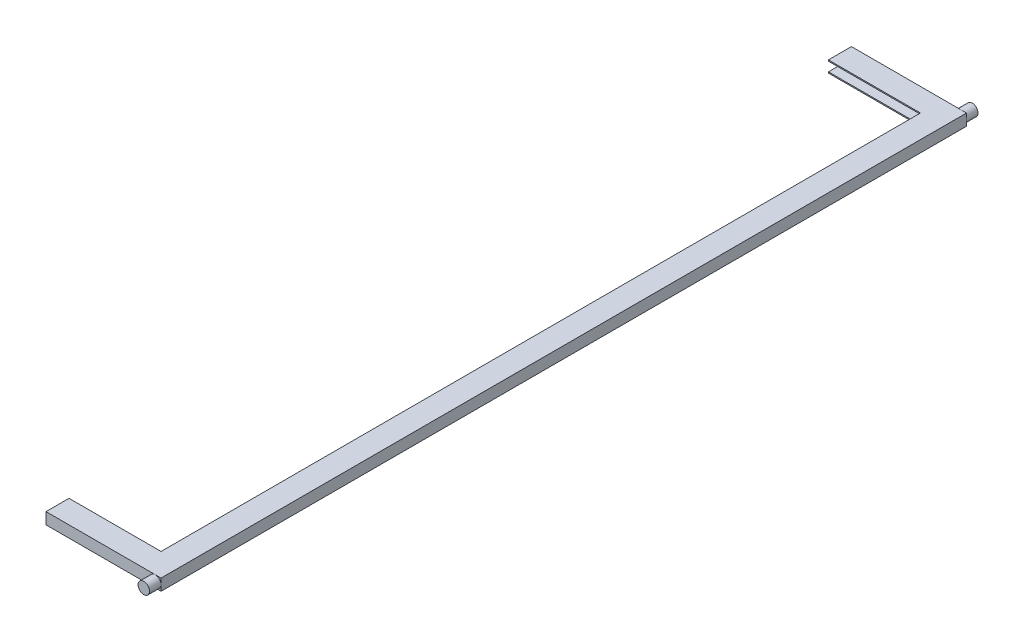
ISO-10303-21;
HEADER;
FILE_DESCRIPTION(('STEP AP214'),'2;1');
FILE_NAME('part.step','',(''),(''),'','','');
FILE_SCHEMA(('AUTOMOTIVE_DESIGN { 1 0 10303 214 1 1 1 1 }'));
ENDSEC;
DATA;
#1=APPLICATION_CONTEXT('core data for automotive mechanical design processes');
#2=APPLICATION_PROTOCOL_DEFINITION('international standard','automotive_design',2000,#1);
#3=PRODUCT_CONTEXT('',#1,'mechanical');
#4=PRODUCT('Part','Part','',(#3));
#5=PRODUCT_RELATED_PRODUCT_CATEGORY('part','',(#4));
#6=PRODUCT_DEFINITION_FORMATION('','',#4);
#7=PRODUCT_DEFINITION_CONTEXT('part definition',#1,'design');
#8=PRODUCT_DEFINITION('design','',#6,#7);
#9=PRODUCT_DEFINITION_SHAPE('','',#8);
#10=(LENGTH_UNIT() NAMED_UNIT(*) SI_UNIT(.MILLI.,.METRE.));
#11=(NAMED_UNIT(*) PLANE_ANGLE_UNIT() SI_UNIT($,.RADIAN.));
#12=(NAMED_UNIT(*) SI_UNIT($,.STERADIAN.) SOLID_ANGLE_UNIT());
#13=UNCERTAINTY_MEASURE_WITH_UNIT(LENGTH_MEASURE(1.E-05),#10,'distance_accuracy_value','');
#14=(GEOMETRIC_REPRESENTATION_CONTEXT(3) GLOBAL_UNCERTAINTY_ASSIGNED_CONTEXT((#13)) GLOBAL_UNIT_ASSIGNED_CONTEXT((#10,
#11,#12)) REPRESENTATION_CONTEXT('',''));
#15=CARTESIAN_POINT('',(0.,0.,0.));
#16=DIRECTION('',(0.,0.,1.));
#17=DIRECTION('',(1.,0.,0.));
#18=AXIS2_PLACEMENT_3D('',#15,#16,#17);
#19=CARTESIAN_POINT('',(-50.,10.,350.));
#20=DIRECTION('',(1.,0.,0.));
#21=DIRECTION('',(0.,0.,-1.));
#22=AXIS2_PLACEMENT_3D('',#19,#20,#21);
#23=PLANE('',#22);
#24=DIRECTION('',(0.,0.,1.));
#25=VECTOR('',#24,1.);
#26=CARTESIAN_POINT('',(-50.,0.,350.));
#27=LINE('',#26,#25);
#28=CARTESIAN_POINT('',(-50.,0.,-350.));
#29=VERTEX_POINT('',#28);
#30=CARTESIAN_POINT('',(-50.,0.,-330.));
#31=VERTEX_POINT('',#30);
#32=EDGE_CURVE('E190',#29,#31,#27,.T.);
#33=ORIENTED_EDGE('',*,*,#32,.T.);
#34=DIRECTION('',(0.,1.,0.));
#35=VECTOR('',#34,1.);
#36=CARTESIAN_POINT('',(-50.,0.,-330.));
#37=LINE('',#36,#35);
#38=CARTESIAN_POINT('',(-50.,1.,-330.));
#39=VERTEX_POINT('',#38);
#40=EDGE_CURVE('E234',#31,#39,#37,.T.);
#41=ORIENTED_EDGE('',*,*,#40,.T.);
#42=DIRECTION('',(0.,0.,1.));
#43=VECTOR('',#42,1.);
#44=CARTESIAN_POINT('',(-50.,1.,-349.));
#45=LINE('',#44,#43);
#46=CARTESIAN_POINT('',(-50.,1.,-349.));
#47=VERTEX_POINT('',#46);
#48=EDGE_CURVE('E264',#47,#39,#45,.T.);
#49=ORIENTED_EDGE('',*,*,#48,.F.);
#50=DIRECTION('',(0.,-1.,0.));
#51=VECTOR('',#50,1.);
#52=CARTESIAN_POINT('',(-50.,9.,-349.));
#53=LINE('',#52,#51);
#54=CARTESIAN_POINT('',(-50.,9.,-349.));
#55=VERTEX_POINT('',#54);
#56=EDGE_CURVE('E250',#55,#47,#53,.T.);
#57=ORIENTED_EDGE('',*,*,#56,.F.);
#58=DIRECTION('',(0.,0.,1.));
#59=VECTOR('',#58,1.);
#60=CARTESIAN_POINT('',(-50.,9.,-349.));
#61=LINE('',#60,#59);
#62=CARTESIAN_POINT('',(-50.,9.,-330.));
#63=VERTEX_POINT('',#62);
#64=EDGE_CURVE('E259',#55,#63,#61,.T.);
#65=ORIENTED_EDGE('',*,*,#64,.T.);
#66=CARTESIAN_POINT('',(-50.,10.,-330.));
#67=VERTEX_POINT('',#66);
#68=EDGE_CURVE('E230',#63,#67,#37,.T.);
#69=ORIENTED_EDGE('',*,*,#68,.T.);
#70=DIRECTION('',(0.,0.,1.));
#71=VECTOR('',#70,1.);
#72=CARTESIAN_POINT('',(-50.,10.,350.));
#73=LINE('',#72,#71);
#74=CARTESIAN_POINT('',(-50.,10.,-350.));
#75=VERTEX_POINT('',#74);
#76=EDGE_CURVE('E299',#75,#67,#73,.T.);
#77=ORIENTED_EDGE('',*,*,#76,.F.);
#78=DIRECTION('',(0.,-1.,0.));
#79=VECTOR('',#78,1.);
#80=CARTESIAN_POINT('',(-50.,10.,-350.));
#81=LINE('',#80,#79);
#82=EDGE_CURVE('E207',#75,#29,#81,.T.);
#83=ORIENTED_EDGE('',*,*,#82,.T.);
#84=EDGE_LOOP('',(#33,#41,#49,#57,#65,#69,#77,#83));
#85=FACE_BOUND('',#84,.T.);
#86=ADVANCED_FACE('F33',(#85),#23,.F.);
#87=CARTESIAN_POINT('',(-49.9999999999999,10.,330.));
#88=VERTEX_POINT('',#87);
#89=CARTESIAN_POINT('',(-50.,10.,350.));
#90=VERTEX_POINT('',#89);
#91=EDGE_CURVE('E298',#88,#90,#73,.T.);
#92=ORIENTED_EDGE('',*,*,#91,.F.);
#93=DIRECTION('',(0.,1.,0.));
#94=VECTOR('',#93,1.);
#95=CARTESIAN_POINT('',(-49.9999999999999,0.,330.));
#96=LINE('',#95,#94);
#97=CARTESIAN_POINT('',(-49.9999999999999,9.,330.));
#98=VERTEX_POINT('',#97);
#99=EDGE_CURVE('E182',#98,#88,#96,.T.);
#100=ORIENTED_EDGE('',*,*,#99,.F.);
#101=CARTESIAN_POINT('',(-50.,9.,349.));
#102=VERTEX_POINT('',#101);
#103=EDGE_CURVE('E245',#98,#102,#61,.T.);
#104=ORIENTED_EDGE('',*,*,#103,.T.);
#105=DIRECTION('',(0.,-1.,0.));
#106=VECTOR('',#105,1.);
#107=CARTESIAN_POINT('',(-50.,9.,349.));
#108=LINE('',#107,#106);
#109=CARTESIAN_POINT('',(-50.,1.,349.));
#110=VERTEX_POINT('',#109);
#111=EDGE_CURVE('E262',#102,#110,#108,.T.);
#112=ORIENTED_EDGE('',*,*,#111,.T.);
#113=CARTESIAN_POINT('',(-50.,1.,330.));
#114=VERTEX_POINT('',#113);
#115=EDGE_CURVE('E181',#114,#110,#45,.T.);
#116=ORIENTED_EDGE('',*,*,#115,.F.);
#117=CARTESIAN_POINT('',(-49.9999999999999,0.,330.));
#118=VERTEX_POINT('',#117);
#119=EDGE_CURVE('E56',#118,#114,#96,.T.);
#120=ORIENTED_EDGE('',*,*,#119,.F.);
#121=CARTESIAN_POINT('',(-50.,0.,350.));
#122=VERTEX_POINT('',#121);
#123=EDGE_CURVE('E178',#118,#122,#27,.T.);
#124=ORIENTED_EDGE('',*,*,#123,.T.);
#125=DIRECTION('',(0.,-1.,0.));
#126=VECTOR('',#125,1.);
#127=CARTESIAN_POINT('',(-50.,10.,350.));
#128=LINE('',#127,#126);
#129=EDGE_CURVE('E204',#90,#122,#128,.T.);
#130=ORIENTED_EDGE('',*,*,#129,.F.);
#131=EDGE_LOOP('',(#92,#100,#104,#112,#116,#120,#124,#130));
#132=FACE_BOUND('',#131,.T.);
#133=ADVANCED_FACE('F176',(#132),#23,.F.);
#134=CARTESIAN_POINT('',(-50.,10.,-350.));
#135=DIRECTION('',(0.,0.,1.));
#136=DIRECTION('',(1.,0.,0.));
#137=AXIS2_PLACEMENT_3D('',#134,#135,#136);
#138=PLANE('',#137);
#139=CARTESIAN_POINT('',(45.,5.,-350.));
#140=DIRECTION('',(0.,0.,-1.));
#141=DIRECTION('',(-1.,0.,0.));
#142=AXIS2_PLACEMENT_3D('',#139,#140,#141);
#143=CIRCLE('',#142,5.);
#144=CARTESIAN_POINT('',(45.,10.,-350.));
#145=VERTEX_POINT('',#144);
#146=CARTESIAN_POINT('',(50.,5.,-350.));
#147=VERTEX_POINT('',#146);
#148=EDGE_CURVE('E278',#145,#147,#143,.T.);
#149=ORIENTED_EDGE('',*,*,#148,.F.);
#150=DIRECTION('',(-1.,0.,0.));
#151=VECTOR('',#150,1.);
#152=CARTESIAN_POINT('',(-50.,10.,-350.));
#153=LINE('',#152,#151);
#154=CARTESIAN_POINT('',(50.,10.,-350.));
#155=VERTEX_POINT('',#154);
#156=EDGE_CURVE('E296',#155,#145,#153,.T.);
#157=ORIENTED_EDGE('',*,*,#156,.F.);
#158=DIRECTION('',(0.,-1.,0.));
#159=VECTOR('',#158,1.);
#160=CARTESIAN_POINT('',(50.,10.,-350.));
#161=LINE('',#160,#159);
#162=EDGE_CURVE('E211',#155,#147,#161,.T.);
#163=ORIENTED_EDGE('',*,*,#162,.T.);
#164=EDGE_LOOP('',(#149,#157,#163));
#165=FACE_BOUND('',#164,.T.);
#166=ADVANCED_FACE('F337',(#165),#138,.F.);
#167=CARTESIAN_POINT('',(45.,0.,-350.));
#168=VERTEX_POINT('',#167);
#169=EDGE_CURVE('E216',#147,#168,#143,.T.);
#170=ORIENTED_EDGE('',*,*,#169,.F.);
#171=CARTESIAN_POINT('',(50.,0.,-350.));
#172=VERTEX_POINT('',#171);
#173=EDGE_CURVE('E210',#147,#172,#161,.T.);
#174=ORIENTED_EDGE('',*,*,#173,.T.);
#175=DIRECTION('',(-1.,0.,0.));
#176=VECTOR('',#175,1.);
#177=CARTESIAN_POINT('',(-50.,0.,-350.));
#178=LINE('',#177,#176);
#179=EDGE_CURVE('E191',#172,#168,#178,.T.);
#180=ORIENTED_EDGE('',*,*,#179,.T.);
#181=EDGE_LOOP('',(#170,#174,#180));
#182=FACE_BOUND('',#181,.T.);
#183=ADVANCED_FACE('F396',(#182),#138,.F.);
#184=EDGE_CURVE('E285',#168,#145,#143,.T.);
#185=ORIENTED_EDGE('',*,*,#184,.F.);
#186=EDGE_CURVE('E196',#168,#29,#178,.T.);
#187=ORIENTED_EDGE('',*,*,#186,.T.);
#188=ORIENTED_EDGE('',*,*,#82,.F.);
#189=EDGE_CURVE('E295',#145,#75,#153,.T.);
#190=ORIENTED_EDGE('',*,*,#189,.F.);
#191=EDGE_LOOP('',(#185,#187,#188,#190));
#192=FACE_BOUND('',#191,.T.);
#193=ADVANCED_FACE('F312',(#192),#138,.F.);
#194=CARTESIAN_POINT('',(-50.,10.,350.));
#195=DIRECTION('',(0.,0.,-1.));
#196=DIRECTION('',(-1.,0.,0.));
#197=AXIS2_PLACEMENT_3D('',#194,#195,#196);
#198=PLANE('',#197);
#199=CARTESIAN_POINT('',(45.,5.,350.));
#200=DIRECTION('',(0.,0.,1.));
#201=DIRECTION('',(1.,0.,0.));
#202=AXIS2_PLACEMENT_3D('',#199,#200,#201);
#203=CIRCLE('',#202,5.);
#204=CARTESIAN_POINT('',(50.,5.,350.));
#205=VERTEX_POINT('',#204);
#206=CARTESIAN_POINT('',(45.,10.,350.));
#207=VERTEX_POINT('',#206);
#208=EDGE_CURVE('E282',#205,#207,#203,.T.);
#209=ORIENTED_EDGE('',*,*,#208,.F.);
#210=DIRECTION('',(0.,-1.,0.));
#211=VECTOR('',#210,1.);
#212=CARTESIAN_POINT('',(50.,10.,350.));
#213=LINE('',#212,#211);
#214=CARTESIAN_POINT('',(50.,10.,350.));
#215=VERTEX_POINT('',#214);
#216=EDGE_CURVE('E202',#215,#205,#213,.T.);
#217=ORIENTED_EDGE('',*,*,#216,.F.);
#218=DIRECTION('',(1.,0.,0.));
#219=VECTOR('',#218,1.);
#220=CARTESIAN_POINT('',(-50.,10.,350.));
#221=LINE('',#220,#219);
#222=EDGE_CURVE('E302',#207,#215,#221,.T.);
#223=ORIENTED_EDGE('',*,*,#222,.F.);
#224=EDGE_LOOP('',(#209,#217,#223));
#225=FACE_BOUND('',#224,.T.);
#226=ADVANCED_FACE('F393',(#225),#198,.F.);
#227=CARTESIAN_POINT('',(45.,0.,350.));
#228=VERTEX_POINT('',#227);
#229=EDGE_CURVE('E292',#207,#228,#203,.T.);
#230=ORIENTED_EDGE('',*,*,#229,.F.);
#231=EDGE_CURVE('E303',#90,#207,#221,.T.);
#232=ORIENTED_EDGE('',*,*,#231,.F.);
#233=ORIENTED_EDGE('',*,*,#129,.T.);
#234=DIRECTION('',(1.,0.,0.));
#235=VECTOR('',#234,1.);
#236=CARTESIAN_POINT('',(-50.,0.,350.));
#237=LINE('',#236,#235);
#238=EDGE_CURVE('E189',#122,#228,#237,.T.);
#239=ORIENTED_EDGE('',*,*,#238,.T.);
#240=EDGE_LOOP('',(#230,#232,#233,#239));
#241=FACE_BOUND('',#240,.T.);
#242=ADVANCED_FACE('F352',(#241),#198,.F.);
#243=EDGE_CURVE('E214',#228,#205,#203,.T.);
#244=ORIENTED_EDGE('',*,*,#243,.F.);
#245=CARTESIAN_POINT('',(50.,0.,350.));
#246=VERTEX_POINT('',#245);
#247=EDGE_CURVE('E194',#228,#246,#237,.T.);
#248=ORIENTED_EDGE('',*,*,#247,.T.);
#249=EDGE_CURVE('E205',#205,#246,#213,.T.);
#250=ORIENTED_EDGE('',*,*,#249,.F.);
#251=EDGE_LOOP('',(#244,#248,#250));
#252=FACE_BOUND('',#251,.T.);
#253=ADVANCED_FACE('F350',(#252),#198,.F.);
#254=CARTESIAN_POINT('',(50.,10.,350.));
#255=DIRECTION('',(-1.,0.,0.));
#256=DIRECTION('',(0.,0.,1.));
#257=AXIS2_PLACEMENT_3D('',#254,#255,#256);
#258=PLANE('',#257);
#259=DIRECTION('',(0.,0.,-1.));
#260=VECTOR('',#259,1.);
#261=CARTESIAN_POINT('',(50.,0.,350.));
#262=LINE('',#261,#260);
#263=EDGE_CURVE('E289',#246,#172,#262,.T.);
#264=ORIENTED_EDGE('',*,*,#263,.T.);
#265=ORIENTED_EDGE('',*,*,#173,.F.);
#266=ORIENTED_EDGE('',*,*,#162,.F.);
#267=DIRECTION('',(0.,0.,-1.));
#268=VECTOR('',#267,1.);
#269=CARTESIAN_POINT('',(50.,10.,350.));
#270=LINE('',#269,#268);
#271=EDGE_CURVE('E201',#215,#155,#270,.T.);
#272=ORIENTED_EDGE('',*,*,#271,.F.);
#273=ORIENTED_EDGE('',*,*,#216,.T.);
#274=ORIENTED_EDGE('',*,*,#249,.T.);
#275=EDGE_LOOP('',(#264,#265,#266,#272,#273,#274));
#276=FACE_BOUND('',#275,.T.);
#277=ADVANCED_FACE('F35',(#276),#258,.F.);
#278=CARTESIAN_POINT('',(0.,10.,0.));
#279=DIRECTION('',(0.,-1.,0.));
#280=DIRECTION('',(0.,0.,-1.));
#281=AXIS2_PLACEMENT_3D('',#278,#279,#280);
#282=PLANE('',#281);
#283=ORIENTED_EDGE('',*,*,#76,.T.);
#284=DIRECTION('',(-1.,0.,0.));
#285=VECTOR('',#284,1.);
#286=CARTESIAN_POINT('',(-50.,10.,-330.));
#287=LINE('',#286,#285);
#288=CARTESIAN_POINT('',(30.,10.,-330.));
#289=VERTEX_POINT('',#288);
#290=EDGE_CURVE('E171',#289,#67,#287,.T.);
#291=ORIENTED_EDGE('',*,*,#290,.F.);
#292=DIRECTION('',(0.,0.,-1.));
#293=VECTOR('',#292,1.);
#294=CARTESIAN_POINT('',(30.,10.,-330.));
#295=LINE('',#294,#293);
#296=CARTESIAN_POINT('',(30.0000000000001,10.,330.));
#297=VERTEX_POINT('',#296);
#298=EDGE_CURVE('E324',#297,#289,#295,.T.);
#299=ORIENTED_EDGE('',*,*,#298,.F.);
#300=DIRECTION('',(1.,0.,0.));
#301=VECTOR('',#300,1.);
#302=CARTESIAN_POINT('',(-49.9999999999999,10.,330.));
#303=LINE('',#302,#301);
#304=EDGE_CURVE('E322',#88,#297,#303,.T.);
#305=ORIENTED_EDGE('',*,*,#304,.F.);
#306=ORIENTED_EDGE('',*,*,#91,.T.);
#307=ORIENTED_EDGE('',*,*,#231,.T.);
#308=ORIENTED_EDGE('',*,*,#222,.T.);
#309=ORIENTED_EDGE('',*,*,#271,.T.);
#310=ORIENTED_EDGE('',*,*,#156,.T.);
#311=ORIENTED_EDGE('',*,*,#189,.T.);
#312=EDGE_LOOP('',(#283,#291,#299,#305,#306,#307,#308,#309,#310,#311));
#313=FACE_BOUND('',#312,.T.);
#314=ADVANCED_FACE('F334',(#313),#282,.F.);
#315=CARTESIAN_POINT('',(0.,0.,0.));
#316=DIRECTION('',(0.,-1.,0.));
#317=DIRECTION('',(0.,0.,-1.));
#318=AXIS2_PLACEMENT_3D('',#315,#316,#317);
#319=PLANE('',#318);
#320=DIRECTION('',(-1.,0.,0.));
#321=VECTOR('',#320,1.);
#322=CARTESIAN_POINT('',(-50.,0.,-330.));
#323=LINE('',#322,#321);
#324=CARTESIAN_POINT('',(30.,0.,-330.));
#325=VERTEX_POINT('',#324);
#326=EDGE_CURVE('E229',#325,#31,#323,.T.);
#327=ORIENTED_EDGE('',*,*,#326,.T.);
#328=ORIENTED_EDGE('',*,*,#32,.F.);
#329=ORIENTED_EDGE('',*,*,#186,.F.);
#330=ORIENTED_EDGE('',*,*,#179,.F.);
#331=ORIENTED_EDGE('',*,*,#263,.F.);
#332=ORIENTED_EDGE('',*,*,#247,.F.);
#333=ORIENTED_EDGE('',*,*,#238,.F.);
#334=ORIENTED_EDGE('',*,*,#123,.F.);
#335=DIRECTION('',(1.,0.,0.));
#336=VECTOR('',#335,1.);
#337=CARTESIAN_POINT('',(-49.9999999999999,0.,330.));
#338=LINE('',#337,#336);
#339=CARTESIAN_POINT('',(30.0000000000001,0.,330.));
#340=VERTEX_POINT('',#339);
#341=EDGE_CURVE('E162',#118,#340,#338,.T.);
#342=ORIENTED_EDGE('',*,*,#341,.T.);
#343=DIRECTION('',(0.,0.,-1.));
#344=VECTOR('',#343,1.);
#345=CARTESIAN_POINT('',(30.,0.,-330.));
#346=LINE('',#345,#344);
#347=EDGE_CURVE('E170',#340,#325,#346,.T.);
#348=ORIENTED_EDGE('',*,*,#347,.T.);
#349=EDGE_LOOP('',(#327,#328,#329,#330,#331,#332,#333,#334,#342,#348));
#350=FACE_BOUND('',#349,.T.);
#351=ADVANCED_FACE('F186',(#350),#319,.T.);
#352=CARTESIAN_POINT('',(45.,5.,360.));
#353=DIRECTION('',(0.,0.,-1.));
#354=DIRECTION('',(-1.,0.,0.));
#355=AXIS2_PLACEMENT_3D('',#352,#353,#354);
#356=CYLINDRICAL_SURFACE('',#355,5.);
#357=CARTESIAN_POINT('',(45.,5.,360.));
#358=DIRECTION('',(0.,0.,1.));
#359=DIRECTION('',(1.,0.,0.));
#360=AXIS2_PLACEMENT_3D('',#357,#358,#359);
#361=CIRCLE('',#360,5.);
#362=CARTESIAN_POINT('',(50.,5.,360.));
#363=VERTEX_POINT('',#362);
#364=EDGE_CURVE('E286',#363,#363,#361,.T.);
#365=ORIENTED_EDGE('',*,*,#364,.F.);
#366=EDGE_LOOP('',(#365));
#367=FACE_BOUND('',#366,.T.);
#368=ORIENTED_EDGE('',*,*,#208,.T.);
#369=ORIENTED_EDGE('',*,*,#229,.T.);
#370=ORIENTED_EDGE('',*,*,#243,.T.);
#371=EDGE_LOOP('',(#368,#369,#370));
#372=FACE_BOUND('',#371,.T.);
#373=ADVANCED_FACE('F345',(#367,#372),#356,.T.);
#374=CARTESIAN_POINT('',(45.,5.,360.));
#375=DIRECTION('',(0.,0.,1.));
#376=DIRECTION('',(1.,0.,0.));
#377=AXIS2_PLACEMENT_3D('',#374,#375,#376);
#378=PLANE('',#377);
#379=ORIENTED_EDGE('',*,*,#364,.T.);
#380=EDGE_LOOP('',(#379));
#381=FACE_BOUND('',#380,.T.);
#382=ADVANCED_FACE('F423',(#381),#378,.T.);
#383=CARTESIAN_POINT('',(45.,5.,-360.));
#384=DIRECTION('',(0.,0.,1.));
#385=DIRECTION('',(1.,0.,0.));
#386=AXIS2_PLACEMENT_3D('',#383,#384,#385);
#387=CYLINDRICAL_SURFACE('',#386,5.);
#388=CARTESIAN_POINT('',(45.,5.,-360.));
#389=DIRECTION('',(0.,0.,-1.));
#390=DIRECTION('',(-1.,0.,0.));
#391=AXIS2_PLACEMENT_3D('',#388,#389,#390);
#392=CIRCLE('',#391,5.);
#393=CARTESIAN_POINT('',(40.,5.,-360.));
#394=VERTEX_POINT('',#393);
#395=EDGE_CURVE('E279',#394,#394,#392,.T.);
#396=ORIENTED_EDGE('',*,*,#395,.F.);
#397=EDGE_LOOP('',(#396));
#398=FACE_BOUND('',#397,.T.);
#399=ORIENTED_EDGE('',*,*,#148,.T.);
#400=ORIENTED_EDGE('',*,*,#169,.T.);
#401=ORIENTED_EDGE('',*,*,#184,.T.);
#402=EDGE_LOOP('',(#399,#400,#401));
#403=FACE_BOUND('',#402,.T.);
#404=ADVANCED_FACE('F341',(#398,#403),#387,.T.);
#405=CARTESIAN_POINT('',(45.,5.,-360.));
#406=DIRECTION('',(0.,0.,-1.));
#407=DIRECTION('',(-1.,0.,0.));
#408=AXIS2_PLACEMENT_3D('',#405,#406,#407);
#409=PLANE('',#408);
#410=ORIENTED_EDGE('',*,*,#395,.T.);
#411=EDGE_LOOP('',(#410));
#412=FACE_BOUND('',#411,.T.);
#413=ADVANCED_FACE('F430',(#412),#409,.T.);
#414=CARTESIAN_POINT('',(40.,9.,-349.));
#415=DIRECTION('',(0.,-1.,0.));
#416=DIRECTION('',(0.,0.,-1.));
#417=AXIS2_PLACEMENT_3D('',#414,#415,#416);
#418=PLANE('',#417);
#419=DIRECTION('',(1.,0.,0.));
#420=VECTOR('',#419,1.);
#421=CARTESIAN_POINT('',(40.,9.,-330.));
#422=LINE('',#421,#420);
#423=CARTESIAN_POINT('',(30.,9.,-330.));
#424=VERTEX_POINT('',#423);
#425=EDGE_CURVE('E243',#63,#424,#422,.T.);
#426=ORIENTED_EDGE('',*,*,#425,.F.);
#427=ORIENTED_EDGE('',*,*,#64,.F.);
#428=DIRECTION('',(-1.,0.,0.));
#429=VECTOR('',#428,1.);
#430=CARTESIAN_POINT('',(40.,9.,-349.));
#431=LINE('',#430,#429);
#432=CARTESIAN_POINT('',(40.,9.,-349.));
#433=VERTEX_POINT('',#432);
#434=EDGE_CURVE('E258',#433,#55,#431,.T.);
#435=ORIENTED_EDGE('',*,*,#434,.F.);
#436=DIRECTION('',(0.,0.,1.));
#437=VECTOR('',#436,1.);
#438=CARTESIAN_POINT('',(40.,9.,-349.));
#439=LINE('',#438,#437);
#440=CARTESIAN_POINT('',(40.,9.,349.));
#441=VERTEX_POINT('',#440);
#442=EDGE_CURVE('E246',#433,#441,#439,.T.);
#443=ORIENTED_EDGE('',*,*,#442,.T.);
#444=DIRECTION('',(-1.,0.,0.));
#445=VECTOR('',#444,1.);
#446=CARTESIAN_POINT('',(40.,9.,349.));
#447=LINE('',#446,#445);
#448=EDGE_CURVE('E275',#441,#102,#447,.T.);
#449=ORIENTED_EDGE('',*,*,#448,.T.);
#450=ORIENTED_EDGE('',*,*,#103,.F.);
#451=DIRECTION('',(-1.,0.,0.));
#452=VECTOR('',#451,1.);
#453=CARTESIAN_POINT('',(40.,9.,330.));
#454=LINE('',#453,#452);
#455=CARTESIAN_POINT('',(30.0000000000001,9.,330.));
#456=VERTEX_POINT('',#455);
#457=EDGE_CURVE('E239',#456,#98,#454,.T.);
#458=ORIENTED_EDGE('',*,*,#457,.F.);
#459=DIRECTION('',(0.,0.,1.));
#460=VECTOR('',#459,1.);
#461=CARTESIAN_POINT('',(30.,9.,-349.));
#462=LINE('',#461,#460);
#463=EDGE_CURVE('E241',#424,#456,#462,.T.);
#464=ORIENTED_EDGE('',*,*,#463,.F.);
#465=EDGE_LOOP('',(#426,#427,#435,#443,#449,#450,#458,#464));
#466=FACE_BOUND('',#465,.T.);
#467=ADVANCED_FACE('F362',(#466),#418,.T.);
#468=CARTESIAN_POINT('',(40.,9.,349.));
#469=DIRECTION('',(0.,0.,-1.));
#470=DIRECTION('',(-1.,0.,0.));
#471=AXIS2_PLACEMENT_3D('',#468,#469,#470);
#472=PLANE('',#471);
#473=ORIENTED_EDGE('',*,*,#111,.F.);
#474=ORIENTED_EDGE('',*,*,#448,.F.);
#475=DIRECTION('',(0.,-1.,0.));
#476=VECTOR('',#475,1.);
#477=CARTESIAN_POINT('',(40.,9.,349.));
#478=LINE('',#477,#476);
#479=CARTESIAN_POINT('',(40.,1.,349.));
#480=VERTEX_POINT('',#479);
#481=EDGE_CURVE('E249',#441,#480,#478,.T.);
#482=ORIENTED_EDGE('',*,*,#481,.T.);
#483=DIRECTION('',(-1.,0.,0.));
#484=VECTOR('',#483,1.);
#485=CARTESIAN_POINT('',(40.,1.,349.));
#486=LINE('',#485,#484);
#487=EDGE_CURVE('E272',#480,#110,#486,.T.);
#488=ORIENTED_EDGE('',*,*,#487,.T.);
#489=EDGE_LOOP('',(#473,#474,#482,#488));
#490=FACE_BOUND('',#489,.T.);
#491=ADVANCED_FACE('F366',(#490),#472,.T.);
#492=CARTESIAN_POINT('',(40.,1.,-349.));
#493=DIRECTION('',(0.,-1.,0.));
#494=DIRECTION('',(0.,0.,-1.));
#495=AXIS2_PLACEMENT_3D('',#492,#493,#494);
#496=PLANE('',#495);
#497=ORIENTED_EDGE('',*,*,#48,.T.);
#498=DIRECTION('',(1.,0.,0.));
#499=VECTOR('',#498,1.);
#500=CARTESIAN_POINT('',(40.,1.,-330.));
#501=LINE('',#500,#499);
#502=CARTESIAN_POINT('',(30.,1.,-330.));
#503=VERTEX_POINT('',#502);
#504=EDGE_CURVE('E11',#39,#503,#501,.T.);
#505=ORIENTED_EDGE('',*,*,#504,.T.);
#506=DIRECTION('',(0.,0.,1.));
#507=VECTOR('',#506,1.);
#508=CARTESIAN_POINT('',(30.,1.,-349.));
#509=LINE('',#508,#507);
#510=CARTESIAN_POINT('',(30.0000000000001,1.,330.));
#511=VERTEX_POINT('',#510);
#512=EDGE_CURVE('E41',#503,#511,#509,.T.);
#513=ORIENTED_EDGE('',*,*,#512,.T.);
#514=DIRECTION('',(-1.,0.,0.));
#515=VECTOR('',#514,1.);
#516=CARTESIAN_POINT('',(40.,1.,330.));
#517=LINE('',#516,#515);
#518=EDGE_CURVE('E215',#511,#114,#517,.T.);
#519=ORIENTED_EDGE('',*,*,#518,.T.);
#520=ORIENTED_EDGE('',*,*,#115,.T.);
#521=ORIENTED_EDGE('',*,*,#487,.F.);
#522=DIRECTION('',(0.,0.,1.));
#523=VECTOR('',#522,1.);
#524=CARTESIAN_POINT('',(40.,1.,-349.));
#525=LINE('',#524,#523);
#526=CARTESIAN_POINT('',(40.,1.,-349.));
#527=VERTEX_POINT('',#526);
#528=EDGE_CURVE('E252',#527,#480,#525,.T.);
#529=ORIENTED_EDGE('',*,*,#528,.F.);
#530=DIRECTION('',(-1.,0.,0.));
#531=VECTOR('',#530,1.);
#532=CARTESIAN_POINT('',(40.,1.,-349.));
#533=LINE('',#532,#531);
#534=EDGE_CURVE('E270',#527,#47,#533,.T.);
#535=ORIENTED_EDGE('',*,*,#534,.T.);
#536=EDGE_LOOP('',(#497,#505,#513,#519,#520,#521,#529,#535));
#537=FACE_BOUND('',#536,.T.);
#538=ADVANCED_FACE('F220',(#537),#496,.F.);
#539=CARTESIAN_POINT('',(40.,9.,-349.));
#540=DIRECTION('',(0.,0.,-1.));
#541=DIRECTION('',(-1.,0.,0.));
#542=AXIS2_PLACEMENT_3D('',#539,#540,#541);
#543=PLANE('',#542);
#544=ORIENTED_EDGE('',*,*,#56,.T.);
#545=ORIENTED_EDGE('',*,*,#534,.F.);
#546=DIRECTION('',(0.,-1.,0.));
#547=VECTOR('',#546,1.);
#548=CARTESIAN_POINT('',(40.,9.,-349.));
#549=LINE('',#548,#547);
#550=EDGE_CURVE('E255',#433,#527,#549,.T.);
#551=ORIENTED_EDGE('',*,*,#550,.F.);
#552=ORIENTED_EDGE('',*,*,#434,.T.);
#553=EDGE_LOOP('',(#544,#545,#551,#552));
#554=FACE_BOUND('',#553,.T.);
#555=ADVANCED_FACE('F374',(#554),#543,.F.);
#556=CARTESIAN_POINT('',(40.,0.,0.));
#557=DIRECTION('',(1.,0.,0.));
#558=DIRECTION('',(0.,0.,-1.));
#559=AXIS2_PLACEMENT_3D('',#556,#557,#558);
#560=PLANE('',#559);
#561=ORIENTED_EDGE('',*,*,#442,.F.);
#562=ORIENTED_EDGE('',*,*,#550,.T.);
#563=ORIENTED_EDGE('',*,*,#528,.T.);
#564=ORIENTED_EDGE('',*,*,#481,.F.);
#565=EDGE_LOOP('',(#561,#562,#563,#564));
#566=FACE_BOUND('',#565,.T.);
#567=ADVANCED_FACE('F371',(#566),#560,.F.);
#568=CARTESIAN_POINT('',(-49.9999999999999,0.,330.));
#569=DIRECTION('',(0.,0.,1.));
#570=DIRECTION('',(1.,0.,0.));
#571=AXIS2_PLACEMENT_3D('',#568,#569,#570);
#572=PLANE('',#571);
#573=DIRECTION('',(0.,1.,0.));
#574=VECTOR('',#573,1.);
#575=CARTESIAN_POINT('',(30.0000000000001,0.,330.));
#576=LINE('',#575,#574);
#577=EDGE_CURVE('E165',#340,#511,#576,.T.);
#578=ORIENTED_EDGE('',*,*,#577,.F.);
#579=ORIENTED_EDGE('',*,*,#341,.F.);
#580=ORIENTED_EDGE('',*,*,#119,.T.);
#581=ORIENTED_EDGE('',*,*,#518,.F.);
#582=EDGE_LOOP('',(#578,#579,#580,#581));
#583=FACE_BOUND('',#582,.T.);
#584=ADVANCED_FACE('F163',(#583),#572,.F.);
#585=CARTESIAN_POINT('',(30.,0.,-330.));
#586=DIRECTION('',(1.,0.,0.));
#587=DIRECTION('',(0.,0.,-1.));
#588=AXIS2_PLACEMENT_3D('',#585,#586,#587);
#589=PLANE('',#588);
#590=DIRECTION('',(0.,1.,0.));
#591=VECTOR('',#590,1.);
#592=CARTESIAN_POINT('',(30.,0.,-330.));
#593=LINE('',#592,#591);
#594=EDGE_CURVE('E224',#325,#503,#593,.T.);
#595=ORIENTED_EDGE('',*,*,#594,.F.);
#596=ORIENTED_EDGE('',*,*,#347,.F.);
#597=ORIENTED_EDGE('',*,*,#577,.T.);
#598=ORIENTED_EDGE('',*,*,#512,.F.);
#599=EDGE_LOOP('',(#595,#596,#597,#598));
#600=FACE_BOUND('',#599,.T.);
#601=ADVANCED_FACE('F223',(#600),#589,.F.);
#602=CARTESIAN_POINT('',(-50.,0.,-330.));
#603=DIRECTION('',(0.,0.,-1.));
#604=DIRECTION('',(-1.,0.,0.));
#605=AXIS2_PLACEMENT_3D('',#602,#603,#604);
#606=PLANE('',#605);
#607=ORIENTED_EDGE('',*,*,#40,.F.);
#608=ORIENTED_EDGE('',*,*,#326,.F.);
#609=ORIENTED_EDGE('',*,*,#594,.T.);
#610=ORIENTED_EDGE('',*,*,#504,.F.);
#611=EDGE_LOOP('',(#607,#608,#609,#610));
#612=FACE_BOUND('',#611,.T.);
#613=ADVANCED_FACE('F227',(#612),#606,.F.);
#614=ORIENTED_EDGE('',*,*,#425,.T.);
#615=EDGE_CURVE('E231',#424,#289,#593,.T.);
#616=ORIENTED_EDGE('',*,*,#615,.T.);
#617=ORIENTED_EDGE('',*,*,#290,.T.);
#618=ORIENTED_EDGE('',*,*,#68,.F.);
#619=EDGE_LOOP('',(#614,#616,#617,#618));
#620=FACE_BOUND('',#619,.T.);
#621=ADVANCED_FACE('F328',(#620),#606,.F.);
#622=ORIENTED_EDGE('',*,*,#463,.T.);
#623=EDGE_CURVE('E48',#456,#297,#576,.T.);
#624=ORIENTED_EDGE('',*,*,#623,.T.);
#625=ORIENTED_EDGE('',*,*,#298,.T.);
#626=ORIENTED_EDGE('',*,*,#615,.F.);
#627=EDGE_LOOP('',(#622,#624,#625,#626));
#628=FACE_BOUND('',#627,.T.);
#629=ADVANCED_FACE('F377',(#628),#589,.F.);
#630=ORIENTED_EDGE('',*,*,#457,.T.);
#631=ORIENTED_EDGE('',*,*,#99,.T.);
#632=ORIENTED_EDGE('',*,*,#304,.T.);
#633=ORIENTED_EDGE('',*,*,#623,.F.);
#634=EDGE_LOOP('',(#630,#631,#632,#633));
#635=FACE_BOUND('',#634,.T.);
#636=ADVANCED_FACE('F358',(#635),#572,.F.);
#637=CLOSED_SHELL('',(#86,#133,#166,#183,#193,#226,#242,#253,#277,#314,#351,#373,#382,#404,#413,
#467,#491,#538,#555,#567,#584,#601,#613,#621,#629,#636));
#638=MANIFOLD_SOLID_BREP('B2',#637);
#639=ADVANCED_BREP_SHAPE_REPRESENTATION('',(#18,#638),#14);
#640=SHAPE_DEFINITION_REPRESENTATION(#9,#639);
ENDSEC;
END-ISO-10303-21;
